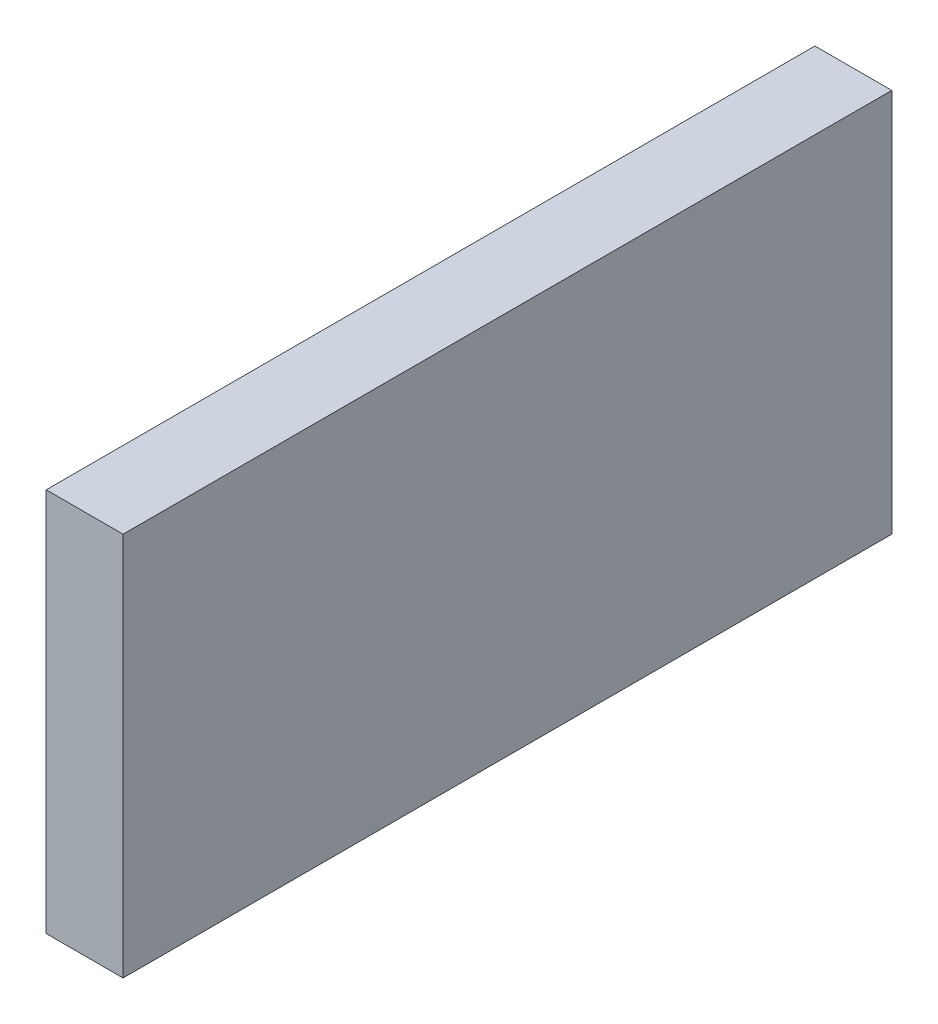
ISO-10303-21;
HEADER;
FILE_DESCRIPTION(('STEP AP214'),'2;1');
FILE_NAME('part.step','',(''),(''),'','','');
FILE_SCHEMA(('AUTOMOTIVE_DESIGN { 1 0 10303 214 1 1 1 1 }'));
ENDSEC;
DATA;
#1=APPLICATION_CONTEXT('core data for automotive mechanical design processes');
#2=APPLICATION_PROTOCOL_DEFINITION('international standard','automotive_design',2000,#1);
#3=PRODUCT_CONTEXT('',#1,'mechanical');
#4=PRODUCT('Part','Part','',(#3));
#5=PRODUCT_RELATED_PRODUCT_CATEGORY('part','',(#4));
#6=PRODUCT_DEFINITION_FORMATION('','',#4);
#7=PRODUCT_DEFINITION_CONTEXT('part definition',#1,'design');
#8=PRODUCT_DEFINITION('design','',#6,#7);
#9=PRODUCT_DEFINITION_SHAPE('','',#8);
#10=(LENGTH_UNIT() NAMED_UNIT(*) SI_UNIT(.MILLI.,.METRE.));
#11=(NAMED_UNIT(*) PLANE_ANGLE_UNIT() SI_UNIT($,.RADIAN.));
#12=(NAMED_UNIT(*) SI_UNIT($,.STERADIAN.) SOLID_ANGLE_UNIT());
#13=UNCERTAINTY_MEASURE_WITH_UNIT(LENGTH_MEASURE(1.E-05),#10,'distance_accuracy_value','');
#14=(GEOMETRIC_REPRESENTATION_CONTEXT(3) GLOBAL_UNCERTAINTY_ASSIGNED_CONTEXT((#13)) GLOBAL_UNIT_ASSIGNED_CONTEXT((#10,
#11,#12)) REPRESENTATION_CONTEXT('',''));
#15=CARTESIAN_POINT('',(0.,0.,0.));
#16=DIRECTION('',(0.,0.,1.));
#17=DIRECTION('',(1.,0.,0.));
#18=AXIS2_PLACEMENT_3D('',#15,#16,#17);
#19=CARTESIAN_POINT('',(4.,0.,0.));
#20=DIRECTION('',(0.,0.,-1.));
#21=DIRECTION('',(-1.,0.,0.));
#22=AXIS2_PLACEMENT_3D('',#19,#20,#21);
#23=PLANE('',#22);
#24=DIRECTION('',(0.,-1.,0.));
#25=VECTOR('',#24,1.);
#26=CARTESIAN_POINT('',(0.,0.,0.));
#27=LINE('',#26,#25);
#28=CARTESIAN_POINT('',(0.,20.,0.));
#29=VERTEX_POINT('',#28);
#30=CARTESIAN_POINT('',(0.,0.,0.));
#31=VERTEX_POINT('',#30);
#32=EDGE_CURVE('E105',#29,#31,#27,.T.);
#33=ORIENTED_EDGE('',*,*,#32,.T.);
#34=DIRECTION('',(-1.,0.,0.));
#35=VECTOR('',#34,1.);
#36=CARTESIAN_POINT('',(4.,0.,0.));
#37=LINE('',#36,#35);
#38=CARTESIAN_POINT('',(4.,0.,0.));
#39=VERTEX_POINT('',#38);
#40=EDGE_CURVE('E11',#39,#31,#37,.T.);
#41=ORIENTED_EDGE('',*,*,#40,.F.);
#42=DIRECTION('',(0.,-1.,0.));
#43=VECTOR('',#42,1.);
#44=CARTESIAN_POINT('',(4.,0.,0.));
#45=LINE('',#44,#43);
#46=CARTESIAN_POINT('',(4.,20.,0.));
#47=VERTEX_POINT('',#46);
#48=EDGE_CURVE('E89',#47,#39,#45,.T.);
#49=ORIENTED_EDGE('',*,*,#48,.F.);
#50=DIRECTION('',(-1.,0.,0.));
#51=VECTOR('',#50,1.);
#52=CARTESIAN_POINT('',(4.,20.,0.));
#53=LINE('',#52,#51);
#54=EDGE_CURVE('E97',#47,#29,#53,.T.);
#55=ORIENTED_EDGE('',*,*,#54,.T.);
#56=EDGE_LOOP('',(#33,#41,#49,#55));
#57=FACE_BOUND('',#56,.T.);
#58=ADVANCED_FACE('F39',(#57),#23,.F.);
#59=CARTESIAN_POINT('',(4.,0.,0.));
#60=DIRECTION('',(0.,1.,0.));
#61=DIRECTION('',(0.,0.,1.));
#62=AXIS2_PLACEMENT_3D('',#59,#60,#61);
#63=PLANE('',#62);
#64=DIRECTION('',(0.,0.,-1.));
#65=VECTOR('',#64,1.);
#66=CARTESIAN_POINT('',(0.,0.,0.));
#67=LINE('',#66,#65);
#68=CARTESIAN_POINT('',(0.,0.,-40.));
#69=VERTEX_POINT('',#68);
#70=EDGE_CURVE('E92',#31,#69,#67,.T.);
#71=ORIENTED_EDGE('',*,*,#70,.T.);
#72=DIRECTION('',(-1.,0.,0.));
#73=VECTOR('',#72,1.);
#74=CARTESIAN_POINT('',(4.,0.,-40.));
#75=LINE('',#74,#73);
#76=CARTESIAN_POINT('',(4.,0.,-40.));
#77=VERTEX_POINT('',#76);
#78=EDGE_CURVE('E50',#77,#69,#75,.T.);
#79=ORIENTED_EDGE('',*,*,#78,.F.);
#80=DIRECTION('',(0.,0.,-1.));
#81=VECTOR('',#80,1.);
#82=CARTESIAN_POINT('',(4.,0.,0.));
#83=LINE('',#82,#81);
#84=EDGE_CURVE('E82',#39,#77,#83,.T.);
#85=ORIENTED_EDGE('',*,*,#84,.F.);
#86=ORIENTED_EDGE('',*,*,#40,.T.);
#87=EDGE_LOOP('',(#71,#79,#85,#86));
#88=FACE_BOUND('',#87,.T.);
#89=ADVANCED_FACE('F93',(#88),#63,.F.);
#90=CARTESIAN_POINT('',(4.,0.,-40.));
#91=DIRECTION('',(0.,0.,1.));
#92=DIRECTION('',(1.,0.,0.));
#93=AXIS2_PLACEMENT_3D('',#90,#91,#92);
#94=PLANE('',#93);
#95=DIRECTION('',(0.,1.,0.));
#96=VECTOR('',#95,1.);
#97=CARTESIAN_POINT('',(0.,0.,-40.));
#98=LINE('',#97,#96);
#99=CARTESIAN_POINT('',(0.,20.,-40.));
#100=VERTEX_POINT('',#99);
#101=EDGE_CURVE('E72',#69,#100,#98,.T.);
#102=ORIENTED_EDGE('',*,*,#101,.T.);
#103=DIRECTION('',(-1.,0.,0.));
#104=VECTOR('',#103,1.);
#105=CARTESIAN_POINT('',(4.,20.,-40.));
#106=LINE('',#105,#104);
#107=CARTESIAN_POINT('',(4.,20.,-40.));
#108=VERTEX_POINT('',#107);
#109=EDGE_CURVE('E94',#108,#100,#106,.T.);
#110=ORIENTED_EDGE('',*,*,#109,.F.);
#111=DIRECTION('',(0.,1.,0.));
#112=VECTOR('',#111,1.);
#113=CARTESIAN_POINT('',(4.,0.,-40.));
#114=LINE('',#113,#112);
#115=EDGE_CURVE('E88',#77,#108,#114,.T.);
#116=ORIENTED_EDGE('',*,*,#115,.F.);
#117=ORIENTED_EDGE('',*,*,#78,.T.);
#118=EDGE_LOOP('',(#102,#110,#116,#117));
#119=FACE_BOUND('',#118,.T.);
#120=ADVANCED_FACE('F96',(#119),#94,.F.);
#121=CARTESIAN_POINT('',(4.,20.,0.));
#122=DIRECTION('',(0.,-1.,0.));
#123=DIRECTION('',(0.,0.,-1.));
#124=AXIS2_PLACEMENT_3D('',#121,#122,#123);
#125=PLANE('',#124);
#126=DIRECTION('',(0.,0.,1.));
#127=VECTOR('',#126,1.);
#128=CARTESIAN_POINT('',(0.,20.,0.));
#129=LINE('',#128,#127);
#130=EDGE_CURVE('E76',#100,#29,#129,.T.);
#131=ORIENTED_EDGE('',*,*,#130,.T.);
#132=ORIENTED_EDGE('',*,*,#54,.F.);
#133=DIRECTION('',(0.,0.,1.));
#134=VECTOR('',#133,1.);
#135=CARTESIAN_POINT('',(4.,20.,0.));
#136=LINE('',#135,#134);
#137=EDGE_CURVE('E54',#108,#47,#136,.T.);
#138=ORIENTED_EDGE('',*,*,#137,.F.);
#139=ORIENTED_EDGE('',*,*,#109,.T.);
#140=EDGE_LOOP('',(#131,#132,#138,#139));
#141=FACE_BOUND('',#140,.T.);
#142=ADVANCED_FACE('F108',(#141),#125,.F.);
#143=CARTESIAN_POINT('',(4.,0.,0.));
#144=DIRECTION('',(-1.,0.,0.));
#145=DIRECTION('',(0.,0.,1.));
#146=AXIS2_PLACEMENT_3D('',#143,#144,#145);
#147=PLANE('',#146);
#148=ORIENTED_EDGE('',*,*,#48,.T.);
#149=ORIENTED_EDGE('',*,*,#84,.T.);
#150=ORIENTED_EDGE('',*,*,#115,.T.);
#151=ORIENTED_EDGE('',*,*,#137,.T.);
#152=EDGE_LOOP('',(#148,#149,#150,#151));
#153=FACE_BOUND('',#152,.T.);
#154=ADVANCED_FACE('F86',(#153),#147,.F.);
#155=CARTESIAN_POINT('',(0.,0.,0.));
#156=DIRECTION('',(-1.,0.,0.));
#157=DIRECTION('',(0.,0.,1.));
#158=AXIS2_PLACEMENT_3D('',#155,#156,#157);
#159=PLANE('',#158);
#160=ORIENTED_EDGE('',*,*,#32,.F.);
#161=ORIENTED_EDGE('',*,*,#130,.F.);
#162=ORIENTED_EDGE('',*,*,#101,.F.);
#163=ORIENTED_EDGE('',*,*,#70,.F.);
#164=EDGE_LOOP('',(#160,#161,#162,#163));
#165=FACE_BOUND('',#164,.T.);
#166=ADVANCED_FACE('F115',(#165),#159,.T.);
#167=CLOSED_SHELL('',(#58,#89,#120,#142,#154,#166));
#168=MANIFOLD_SOLID_BREP('B2',#167);
#169=ADVANCED_BREP_SHAPE_REPRESENTATION('',(#18,#168),#14);
#170=SHAPE_DEFINITION_REPRESENTATION(#9,#169);
ENDSEC;
END-ISO-10303-21;
